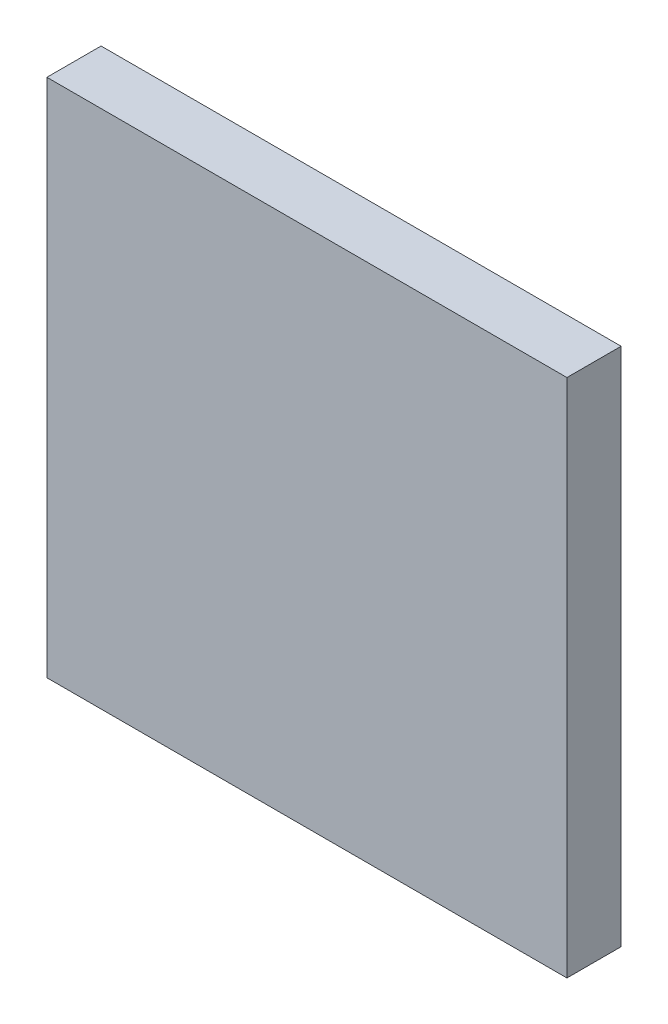
ISO-10303-21;
HEADER;
FILE_DESCRIPTION(('STEP AP214'),'2;1');
FILE_NAME('part.step','',(''),(''),'','','');
FILE_SCHEMA(('AUTOMOTIVE_DESIGN { 1 0 10303 214 1 1 1 1 }'));
ENDSEC;
DATA;
#1=APPLICATION_CONTEXT('core data for automotive mechanical design processes');
#2=APPLICATION_PROTOCOL_DEFINITION('international standard','automotive_design',2000,#1);
#3=PRODUCT_CONTEXT('',#1,'mechanical');
#4=PRODUCT('Part','Part','',(#3));
#5=PRODUCT_RELATED_PRODUCT_CATEGORY('part','',(#4));
#6=PRODUCT_DEFINITION_FORMATION('','',#4);
#7=PRODUCT_DEFINITION_CONTEXT('part definition',#1,'design');
#8=PRODUCT_DEFINITION('design','',#6,#7);
#9=PRODUCT_DEFINITION_SHAPE('','',#8);
#10=(LENGTH_UNIT() NAMED_UNIT(*) SI_UNIT(.MILLI.,.METRE.));
#11=(NAMED_UNIT(*) PLANE_ANGLE_UNIT() SI_UNIT($,.RADIAN.));
#12=(NAMED_UNIT(*) SI_UNIT($,.STERADIAN.) SOLID_ANGLE_UNIT());
#13=UNCERTAINTY_MEASURE_WITH_UNIT(LENGTH_MEASURE(1.E-05),#10,'distance_accuracy_value','');
#14=(GEOMETRIC_REPRESENTATION_CONTEXT(3) GLOBAL_UNCERTAINTY_ASSIGNED_CONTEXT((#13)) GLOBAL_UNIT_ASSIGNED_CONTEXT((#10,
#11,#12)) REPRESENTATION_CONTEXT('',''));
#15=CARTESIAN_POINT('',(0.,0.,0.));
#16=DIRECTION('',(0.,0.,1.));
#17=DIRECTION('',(1.,0.,0.));
#18=AXIS2_PLACEMENT_3D('',#15,#16,#17);
#19=CARTESIAN_POINT('',(48.,48.,5.));
#20=DIRECTION('',(-1.,0.,0.));
#21=DIRECTION('',(0.,-1.,0.));
#22=AXIS2_PLACEMENT_3D('',#19,#20,#21);
#23=PLANE('',#22);
#24=DIRECTION('',(0.,1.,0.));
#25=VECTOR('',#24,1.);
#26=CARTESIAN_POINT('',(48.,48.,-5.));
#27=LINE('',#26,#25);
#28=CARTESIAN_POINT('',(48.,-48.,-5.));
#29=VERTEX_POINT('',#28);
#30=CARTESIAN_POINT('',(48.,48.,-5.));
#31=VERTEX_POINT('',#30);
#32=EDGE_CURVE('E97',#29,#31,#27,.T.);
#33=ORIENTED_EDGE('',*,*,#32,.T.);
#34=DIRECTION('',(0.,0.,-1.));
#35=VECTOR('',#34,1.);
#36=CARTESIAN_POINT('',(48.,48.,5.));
#37=LINE('',#36,#35);
#38=CARTESIAN_POINT('',(48.,48.,5.));
#39=VERTEX_POINT('',#38);
#40=EDGE_CURVE('E11',#39,#31,#37,.T.);
#41=ORIENTED_EDGE('',*,*,#40,.F.);
#42=DIRECTION('',(0.,1.,0.));
#43=VECTOR('',#42,1.);
#44=CARTESIAN_POINT('',(48.,48.,5.));
#45=LINE('',#44,#43);
#46=CARTESIAN_POINT('',(48.,-48.,5.));
#47=VERTEX_POINT('',#46);
#48=EDGE_CURVE('E85',#47,#39,#45,.T.);
#49=ORIENTED_EDGE('',*,*,#48,.F.);
#50=DIRECTION('',(0.,0.,-1.));
#51=VECTOR('',#50,1.);
#52=CARTESIAN_POINT('',(48.,-48.,5.));
#53=LINE('',#52,#51);
#54=EDGE_CURVE('E93',#47,#29,#53,.T.);
#55=ORIENTED_EDGE('',*,*,#54,.T.);
#56=EDGE_LOOP('',(#33,#41,#49,#55));
#57=FACE_BOUND('',#56,.T.);
#58=ADVANCED_FACE('F34',(#57),#23,.F.);
#59=CARTESIAN_POINT('',(-48.,48.,5.));
#60=DIRECTION('',(0.,-1.,0.));
#61=DIRECTION('',(0.,0.,-1.));
#62=AXIS2_PLACEMENT_3D('',#59,#60,#61);
#63=PLANE('',#62);
#64=DIRECTION('',(-1.,0.,0.));
#65=VECTOR('',#64,1.);
#66=CARTESIAN_POINT('',(-48.,48.,-5.));
#67=LINE('',#66,#65);
#68=CARTESIAN_POINT('',(-48.,48.,-5.));
#69=VERTEX_POINT('',#68);
#70=EDGE_CURVE('E89',#31,#69,#67,.T.);
#71=ORIENTED_EDGE('',*,*,#70,.T.);
#72=DIRECTION('',(0.,0.,-1.));
#73=VECTOR('',#72,1.);
#74=CARTESIAN_POINT('',(-48.,48.,5.));
#75=LINE('',#74,#73);
#76=CARTESIAN_POINT('',(-48.,48.,5.));
#77=VERTEX_POINT('',#76);
#78=EDGE_CURVE('E42',#77,#69,#75,.T.);
#79=ORIENTED_EDGE('',*,*,#78,.F.);
#80=DIRECTION('',(-1.,0.,0.));
#81=VECTOR('',#80,1.);
#82=CARTESIAN_POINT('',(-48.,48.,5.));
#83=LINE('',#82,#81);
#84=EDGE_CURVE('E80',#39,#77,#83,.T.);
#85=ORIENTED_EDGE('',*,*,#84,.F.);
#86=ORIENTED_EDGE('',*,*,#40,.T.);
#87=EDGE_LOOP('',(#71,#79,#85,#86));
#88=FACE_BOUND('',#87,.T.);
#89=ADVANCED_FACE('F88',(#88),#63,.F.);
#90=CARTESIAN_POINT('',(-48.,48.,5.));
#91=DIRECTION('',(1.,0.,0.));
#92=DIRECTION('',(0.,1.,0.));
#93=AXIS2_PLACEMENT_3D('',#90,#91,#92);
#94=PLANE('',#93);
#95=DIRECTION('',(0.,-1.,0.));
#96=VECTOR('',#95,1.);
#97=CARTESIAN_POINT('',(-48.,48.,-5.));
#98=LINE('',#97,#96);
#99=CARTESIAN_POINT('',(-48.,-48.,-5.));
#100=VERTEX_POINT('',#99);
#101=EDGE_CURVE('E67',#69,#100,#98,.T.);
#102=ORIENTED_EDGE('',*,*,#101,.T.);
#103=DIRECTION('',(0.,0.,-1.));
#104=VECTOR('',#103,1.);
#105=CARTESIAN_POINT('',(-48.,-48.,5.));
#106=LINE('',#105,#104);
#107=CARTESIAN_POINT('',(-48.,-48.,5.));
#108=VERTEX_POINT('',#107);
#109=EDGE_CURVE('E90',#108,#100,#106,.T.);
#110=ORIENTED_EDGE('',*,*,#109,.F.);
#111=DIRECTION('',(0.,-1.,0.));
#112=VECTOR('',#111,1.);
#113=CARTESIAN_POINT('',(-48.,48.,5.));
#114=LINE('',#113,#112);
#115=EDGE_CURVE('E83',#77,#108,#114,.T.);
#116=ORIENTED_EDGE('',*,*,#115,.F.);
#117=ORIENTED_EDGE('',*,*,#78,.T.);
#118=EDGE_LOOP('',(#102,#110,#116,#117));
#119=FACE_BOUND('',#118,.T.);
#120=ADVANCED_FACE('F91',(#119),#94,.F.);
#121=CARTESIAN_POINT('',(-48.,-48.,5.));
#122=DIRECTION('',(0.,1.,0.));
#123=DIRECTION('',(0.,0.,1.));
#124=AXIS2_PLACEMENT_3D('',#121,#122,#123);
#125=PLANE('',#124);
#126=DIRECTION('',(1.,0.,0.));
#127=VECTOR('',#126,1.);
#128=CARTESIAN_POINT('',(-48.,-48.,-5.));
#129=LINE('',#128,#127);
#130=EDGE_CURVE('E73',#100,#29,#129,.T.);
#131=ORIENTED_EDGE('',*,*,#130,.T.);
#132=ORIENTED_EDGE('',*,*,#54,.F.);
#133=DIRECTION('',(1.,0.,0.));
#134=VECTOR('',#133,1.);
#135=CARTESIAN_POINT('',(-48.,-48.,5.));
#136=LINE('',#135,#134);
#137=EDGE_CURVE('E50',#108,#47,#136,.T.);
#138=ORIENTED_EDGE('',*,*,#137,.F.);
#139=ORIENTED_EDGE('',*,*,#109,.T.);
#140=EDGE_LOOP('',(#131,#132,#138,#139));
#141=FACE_BOUND('',#140,.T.);
#142=ADVANCED_FACE('F104',(#141),#125,.F.);
#143=CARTESIAN_POINT('',(0.,0.,5.));
#144=DIRECTION('',(0.,0.,1.));
#145=DIRECTION('',(1.,0.,0.));
#146=AXIS2_PLACEMENT_3D('',#143,#144,#145);
#147=PLANE('',#146);
#148=ORIENTED_EDGE('',*,*,#48,.T.);
#149=ORIENTED_EDGE('',*,*,#84,.T.);
#150=ORIENTED_EDGE('',*,*,#115,.T.);
#151=ORIENTED_EDGE('',*,*,#137,.T.);
#152=EDGE_LOOP('',(#148,#149,#150,#151));
#153=FACE_BOUND('',#152,.T.);
#154=ADVANCED_FACE('F81',(#153),#147,.T.);
#155=CARTESIAN_POINT('',(0.,0.,-5.));
#156=DIRECTION('',(0.,0.,1.));
#157=DIRECTION('',(1.,0.,0.));
#158=AXIS2_PLACEMENT_3D('',#155,#156,#157);
#159=PLANE('',#158);
#160=ORIENTED_EDGE('',*,*,#32,.F.);
#161=ORIENTED_EDGE('',*,*,#130,.F.);
#162=ORIENTED_EDGE('',*,*,#101,.F.);
#163=ORIENTED_EDGE('',*,*,#70,.F.);
#164=EDGE_LOOP('',(#160,#161,#162,#163));
#165=FACE_BOUND('',#164,.T.);
#166=ADVANCED_FACE('F107',(#165),#159,.F.);
#167=CLOSED_SHELL('',(#58,#89,#120,#142,#154,#166));
#168=MANIFOLD_SOLID_BREP('B2',#167);
#169=ADVANCED_BREP_SHAPE_REPRESENTATION('',(#18,#168),#14);
#170=SHAPE_DEFINITION_REPRESENTATION(#9,#169);
ENDSEC;
END-ISO-10303-21;
